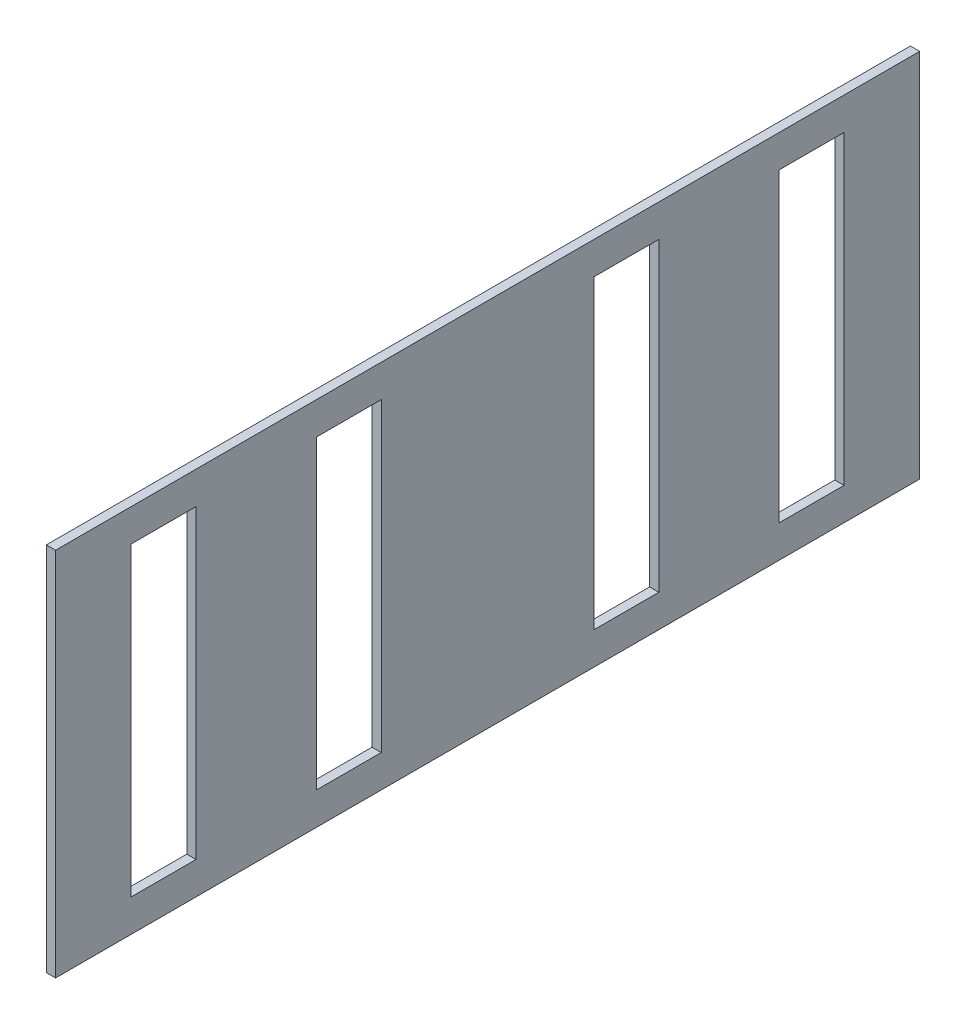
ISO-10303-21;
HEADER;
FILE_DESCRIPTION(('STEP AP214'),'2;1');
FILE_NAME('part.step','',(''),(''),'','','');
FILE_SCHEMA(('AUTOMOTIVE_DESIGN { 1 0 10303 214 1 1 1 1 }'));
ENDSEC;
DATA;
#1=APPLICATION_CONTEXT('core data for automotive mechanical design processes');
#2=APPLICATION_PROTOCOL_DEFINITION('international standard','automotive_design',2000,#1);
#3=PRODUCT_CONTEXT('',#1,'mechanical');
#4=PRODUCT('Part','Part','',(#3));
#5=PRODUCT_RELATED_PRODUCT_CATEGORY('part','',(#4));
#6=PRODUCT_DEFINITION_FORMATION('','',#4);
#7=PRODUCT_DEFINITION_CONTEXT('part definition',#1,'design');
#8=PRODUCT_DEFINITION('design','',#6,#7);
#9=PRODUCT_DEFINITION_SHAPE('','',#8);
#10=(LENGTH_UNIT() NAMED_UNIT(*) SI_UNIT(.MILLI.,.METRE.));
#11=(NAMED_UNIT(*) PLANE_ANGLE_UNIT() SI_UNIT($,.RADIAN.));
#12=(NAMED_UNIT(*) SI_UNIT($,.STERADIAN.) SOLID_ANGLE_UNIT());
#13=UNCERTAINTY_MEASURE_WITH_UNIT(LENGTH_MEASURE(1.E-05),#10,'distance_accuracy_value','');
#14=(GEOMETRIC_REPRESENTATION_CONTEXT(3) GLOBAL_UNCERTAINTY_ASSIGNED_CONTEXT((#13)) GLOBAL_UNIT_ASSIGNED_CONTEXT((#10,
#11,#12)) REPRESENTATION_CONTEXT('',''));
#15=CARTESIAN_POINT('',(0.,0.,0.));
#16=DIRECTION('',(0.,0.,1.));
#17=DIRECTION('',(1.,0.,0.));
#18=AXIS2_PLACEMENT_3D('',#15,#16,#17);
#19=CARTESIAN_POINT('',(2.54,0.,0.));
#20=DIRECTION('',(1.,0.,0.));
#21=DIRECTION('',(0.,0.,-1.));
#22=AXIS2_PLACEMENT_3D('',#19,#20,#21);
#23=PLANE('',#22);
#24=DIRECTION('',(0.,1.,0.));
#25=VECTOR('',#24,1.);
#26=CARTESIAN_POINT('',(2.54,50.8,-118.491));
#27=LINE('',#26,#25);
#28=CARTESIAN_POINT('',(2.54,-50.8,-118.491));
#29=VERTEX_POINT('',#28);
#30=CARTESIAN_POINT('',(2.54,50.8,-118.491));
#31=VERTEX_POINT('',#30);
#32=EDGE_CURVE('E303',#29,#31,#27,.T.);
#33=ORIENTED_EDGE('',*,*,#32,.T.);
#34=DIRECTION('',(0.,0.,1.));
#35=VECTOR('',#34,1.);
#36=CARTESIAN_POINT('',(2.54,50.8,118.491));
#37=LINE('',#36,#35);
#38=CARTESIAN_POINT('',(2.54,50.8,118.491));
#39=VERTEX_POINT('',#38);
#40=EDGE_CURVE('E306',#31,#39,#37,.T.);
#41=ORIENTED_EDGE('',*,*,#40,.T.);
#42=DIRECTION('',(0.,-1.,0.));
#43=VECTOR('',#42,1.);
#44=CARTESIAN_POINT('',(2.54,50.8,118.491));
#45=LINE('',#44,#43);
#46=CARTESIAN_POINT('',(2.54,-50.8,118.491));
#47=VERTEX_POINT('',#46);
#48=EDGE_CURVE('E309',#39,#47,#45,.T.);
#49=ORIENTED_EDGE('',*,*,#48,.T.);
#50=DIRECTION('',(0.,0.,-1.));
#51=VECTOR('',#50,1.);
#52=CARTESIAN_POINT('',(2.54,-50.8,118.491));
#53=LINE('',#52,#51);
#54=EDGE_CURVE('E311',#47,#29,#53,.T.);
#55=ORIENTED_EDGE('',*,*,#54,.T.);
#56=EDGE_LOOP('',(#33,#41,#49,#55));
#57=FACE_BOUND('',#56,.T.);
#58=DIRECTION('',(0.,0.,1.));
#59=VECTOR('',#58,1.);
#60=CARTESIAN_POINT('',(2.54,41.91,-79.9750749999999));
#61=LINE('',#60,#59);
#62=CARTESIAN_POINT('',(2.54,41.91,-97.7550749999999));
#63=VERTEX_POINT('',#62);
#64=CARTESIAN_POINT('',(2.54,41.91,-79.9750749999999));
#65=VERTEX_POINT('',#64);
#66=EDGE_CURVE('E274',#63,#65,#61,.T.);
#67=ORIENTED_EDGE('',*,*,#66,.F.);
#68=DIRECTION('',(0.,1.,0.));
#69=VECTOR('',#68,1.);
#70=CARTESIAN_POINT('',(2.54,41.91,-97.7550749999999));
#71=LINE('',#70,#69);
#72=CARTESIAN_POINT('',(2.54,-41.91,-97.7550749999999));
#73=VERTEX_POINT('',#72);
#74=EDGE_CURVE('E272',#73,#63,#71,.T.);
#75=ORIENTED_EDGE('',*,*,#74,.F.);
#76=DIRECTION('',(0.,0.,-1.));
#77=VECTOR('',#76,1.);
#78=CARTESIAN_POINT('',(2.54,-41.91,-79.9750749999999));
#79=LINE('',#78,#77);
#80=CARTESIAN_POINT('',(2.54,-41.91,-79.9750749999999));
#81=VERTEX_POINT('',#80);
#82=EDGE_CURVE('E280',#81,#73,#79,.T.);
#83=ORIENTED_EDGE('',*,*,#82,.F.);
#84=DIRECTION('',(0.,-1.,0.));
#85=VECTOR('',#84,1.);
#86=CARTESIAN_POINT('',(2.54,41.91,-79.9750749999999));
#87=LINE('',#86,#85);
#88=EDGE_CURVE('E277',#65,#81,#87,.T.);
#89=ORIENTED_EDGE('',*,*,#88,.F.);
#90=EDGE_LOOP('',(#67,#75,#83,#89));
#91=FACE_BOUND('',#90,.T.);
#92=DIRECTION('',(0.,0.,1.));
#93=VECTOR('',#92,1.);
#94=CARTESIAN_POINT('',(2.54,41.91,-29.1750749999999));
#95=LINE('',#94,#93);
#96=CARTESIAN_POINT('',(2.54,41.91,-46.9550749999999));
#97=VERTEX_POINT('',#96);
#98=CARTESIAN_POINT('',(2.54,41.91,-29.1750749999999));
#99=VERTEX_POINT('',#98);
#100=EDGE_CURVE('E243',#97,#99,#95,.T.);
#101=ORIENTED_EDGE('',*,*,#100,.F.);
#102=DIRECTION('',(0.,1.,0.));
#103=VECTOR('',#102,1.);
#104=CARTESIAN_POINT('',(2.54,41.91,-46.9550749999999));
#105=LINE('',#104,#103);
#106=CARTESIAN_POINT('',(2.54,-41.91,-46.9550749999999));
#107=VERTEX_POINT('',#106);
#108=EDGE_CURVE('E241',#107,#97,#105,.T.);
#109=ORIENTED_EDGE('',*,*,#108,.F.);
#110=DIRECTION('',(0.,0.,-1.));
#111=VECTOR('',#110,1.);
#112=CARTESIAN_POINT('',(2.54,-41.91,-29.1750749999999));
#113=LINE('',#112,#111);
#114=CARTESIAN_POINT('',(2.54,-41.91,-29.1750749999999));
#115=VERTEX_POINT('',#114);
#116=EDGE_CURVE('E249',#115,#107,#113,.T.);
#117=ORIENTED_EDGE('',*,*,#116,.F.);
#118=DIRECTION('',(0.,-1.,0.));
#119=VECTOR('',#118,1.);
#120=CARTESIAN_POINT('',(2.54,41.91,-29.1750749999999));
#121=LINE('',#120,#119);
#122=EDGE_CURVE('E246',#99,#115,#121,.T.);
#123=ORIENTED_EDGE('',*,*,#122,.F.);
#124=EDGE_LOOP('',(#101,#109,#117,#123));
#125=FACE_BOUND('',#124,.T.);
#126=DIRECTION('',(0.,0.,1.));
#127=VECTOR('',#126,1.);
#128=CARTESIAN_POINT('',(2.54,41.91,79.9750749999998));
#129=LINE('',#128,#127);
#130=CARTESIAN_POINT('',(2.54,41.91,79.9750749999998));
#131=VERTEX_POINT('',#130);
#132=CARTESIAN_POINT('',(2.54,41.91,97.7550749999998));
#133=VERTEX_POINT('',#132);
#134=EDGE_CURVE('E212',#131,#133,#129,.T.);
#135=ORIENTED_EDGE('',*,*,#134,.F.);
#136=DIRECTION('',(0.,1.,0.));
#137=VECTOR('',#136,1.);
#138=CARTESIAN_POINT('',(2.54,41.91,79.9750749999998));
#139=LINE('',#138,#137);
#140=CARTESIAN_POINT('',(2.54,-41.91,79.9750749999999));
#141=VERTEX_POINT('',#140);
#142=EDGE_CURVE('E210',#141,#131,#139,.T.);
#143=ORIENTED_EDGE('',*,*,#142,.F.);
#144=DIRECTION('',(0.,0.,-1.));
#145=VECTOR('',#144,1.);
#146=CARTESIAN_POINT('',(2.54,-41.91,79.9750749999999));
#147=LINE('',#146,#145);
#148=CARTESIAN_POINT('',(2.54,-41.91,97.7550749999999));
#149=VERTEX_POINT('',#148);
#150=EDGE_CURVE('E218',#149,#141,#147,.T.);
#151=ORIENTED_EDGE('',*,*,#150,.F.);
#152=DIRECTION('',(0.,-1.,0.));
#153=VECTOR('',#152,1.);
#154=CARTESIAN_POINT('',(2.54,41.91,97.7550749999998));
#155=LINE('',#154,#153);
#156=EDGE_CURVE('E215',#133,#149,#155,.T.);
#157=ORIENTED_EDGE('',*,*,#156,.F.);
#158=EDGE_LOOP('',(#135,#143,#151,#157));
#159=FACE_BOUND('',#158,.T.);
#160=DIRECTION('',(0.,-1.,0.));
#161=VECTOR('',#160,1.);
#162=CARTESIAN_POINT('',(2.54,41.91,46.9550749999999));
#163=LINE('',#162,#161);
#164=CARTESIAN_POINT('',(2.54,41.91,46.9550749999999));
#165=VERTEX_POINT('',#164);
#166=CARTESIAN_POINT('',(2.54,-41.9099999999999,46.9550749999999));
#167=VERTEX_POINT('',#166);
#168=EDGE_CURVE('E182',#165,#167,#163,.T.);
#169=ORIENTED_EDGE('',*,*,#168,.F.);
#170=DIRECTION('',(0.,0.,1.));
#171=VECTOR('',#170,1.);
#172=CARTESIAN_POINT('',(2.54,41.91,29.1750749999999));
#173=LINE('',#172,#171);
#174=CARTESIAN_POINT('',(2.54,41.91,29.1750749999999));
#175=VERTEX_POINT('',#174);
#176=EDGE_CURVE('E174',#175,#165,#173,.T.);
#177=ORIENTED_EDGE('',*,*,#176,.F.);
#178=DIRECTION('',(0.,1.,0.));
#179=VECTOR('',#178,1.);
#180=CARTESIAN_POINT('',(2.54,41.91,29.1750749999999));
#181=LINE('',#180,#179);
#182=CARTESIAN_POINT('',(2.54,-41.9099999999999,29.1750749999999));
#183=VERTEX_POINT('',#182);
#184=EDGE_CURVE('E196',#183,#175,#181,.T.);
#185=ORIENTED_EDGE('',*,*,#184,.F.);
#186=DIRECTION('',(0.,0.,-1.));
#187=VECTOR('',#186,1.);
#188=CARTESIAN_POINT('',(2.54,-41.9099999999999,29.1750749999999));
#189=LINE('',#188,#187);
#190=EDGE_CURVE('E194',#167,#183,#189,.T.);
#191=ORIENTED_EDGE('',*,*,#190,.F.);
#192=EDGE_LOOP('',(#169,#177,#185,#191));
#193=FACE_BOUND('',#192,.T.);
#194=ADVANCED_FACE('F37',(#57,#91,#125,#159,#193),#23,.T.);
#195=CARTESIAN_POINT('',(0.,0.,0.));
#196=DIRECTION('',(1.,0.,0.));
#197=DIRECTION('',(0.,0.,-1.));
#198=AXIS2_PLACEMENT_3D('',#195,#196,#197);
#199=PLANE('',#198);
#200=DIRECTION('',(0.,1.,0.));
#201=VECTOR('',#200,1.);
#202=CARTESIAN_POINT('',(0.,41.91,79.9750749999998));
#203=LINE('',#202,#201);
#204=CARTESIAN_POINT('',(0.,-41.91,79.9750749999999));
#205=VERTEX_POINT('',#204);
#206=CARTESIAN_POINT('',(0.,41.91,79.9750749999998));
#207=VERTEX_POINT('',#206);
#208=EDGE_CURVE('E190',#205,#207,#203,.T.);
#209=ORIENTED_EDGE('',*,*,#208,.T.);
#210=DIRECTION('',(0.,0.,1.));
#211=VECTOR('',#210,1.);
#212=CARTESIAN_POINT('',(0.,41.91,79.9750749999998));
#213=LINE('',#212,#211);
#214=CARTESIAN_POINT('',(0.,41.91,97.7550749999998));
#215=VERTEX_POINT('',#214);
#216=EDGE_CURVE('E223',#207,#215,#213,.T.);
#217=ORIENTED_EDGE('',*,*,#216,.T.);
#218=DIRECTION('',(0.,-1.,0.));
#219=VECTOR('',#218,1.);
#220=CARTESIAN_POINT('',(0.,41.91,97.7550749999998));
#221=LINE('',#220,#219);
#222=CARTESIAN_POINT('',(0.,-41.91,97.7550749999999));
#223=VERTEX_POINT('',#222);
#224=EDGE_CURVE('E226',#215,#223,#221,.T.);
#225=ORIENTED_EDGE('',*,*,#224,.T.);
#226=DIRECTION('',(0.,0.,-1.));
#227=VECTOR('',#226,1.);
#228=CARTESIAN_POINT('',(0.,-41.91,79.9750749999999));
#229=LINE('',#228,#227);
#230=EDGE_CURVE('E213',#223,#205,#229,.T.);
#231=ORIENTED_EDGE('',*,*,#230,.T.);
#232=EDGE_LOOP('',(#209,#217,#225,#231));
#233=FACE_BOUND('',#232,.T.);
#234=DIRECTION('',(0.,1.,0.));
#235=VECTOR('',#234,1.);
#236=CARTESIAN_POINT('',(0.,41.91,-97.7550749999999));
#237=LINE('',#236,#235);
#238=CARTESIAN_POINT('',(0.,-41.91,-97.7550749999999));
#239=VERTEX_POINT('',#238);
#240=CARTESIAN_POINT('',(0.,41.91,-97.7550749999999));
#241=VERTEX_POINT('',#240);
#242=EDGE_CURVE('E271',#239,#241,#237,.T.);
#243=ORIENTED_EDGE('',*,*,#242,.T.);
#244=DIRECTION('',(0.,0.,1.));
#245=VECTOR('',#244,1.);
#246=CARTESIAN_POINT('',(0.,41.91,-79.9750749999999));
#247=LINE('',#246,#245);
#248=CARTESIAN_POINT('',(0.,41.91,-79.9750749999999));
#249=VERTEX_POINT('',#248);
#250=EDGE_CURVE('E285',#241,#249,#247,.T.);
#251=ORIENTED_EDGE('',*,*,#250,.T.);
#252=DIRECTION('',(0.,-1.,0.));
#253=VECTOR('',#252,1.);
#254=CARTESIAN_POINT('',(0.,41.91,-79.9750749999999));
#255=LINE('',#254,#253);
#256=CARTESIAN_POINT('',(0.,-41.91,-79.9750749999999));
#257=VERTEX_POINT('',#256);
#258=EDGE_CURVE('E288',#249,#257,#255,.T.);
#259=ORIENTED_EDGE('',*,*,#258,.T.);
#260=DIRECTION('',(0.,0.,-1.));
#261=VECTOR('',#260,1.);
#262=CARTESIAN_POINT('',(0.,-41.91,-79.9750749999999));
#263=LINE('',#262,#261);
#264=EDGE_CURVE('E275',#257,#239,#263,.T.);
#265=ORIENTED_EDGE('',*,*,#264,.T.);
#266=EDGE_LOOP('',(#243,#251,#259,#265));
#267=FACE_BOUND('',#266,.T.);
#268=DIRECTION('',(0.,1.,0.));
#269=VECTOR('',#268,1.);
#270=CARTESIAN_POINT('',(0.,50.8,-118.491));
#271=LINE('',#270,#269);
#272=CARTESIAN_POINT('',(0.,-50.8,-118.491));
#273=VERTEX_POINT('',#272);
#274=CARTESIAN_POINT('',(0.,50.8,-118.491));
#275=VERTEX_POINT('',#274);
#276=EDGE_CURVE('E302',#273,#275,#271,.T.);
#277=ORIENTED_EDGE('',*,*,#276,.F.);
#278=DIRECTION('',(0.,0.,-1.));
#279=VECTOR('',#278,1.);
#280=CARTESIAN_POINT('',(0.,-50.8,118.491));
#281=LINE('',#280,#279);
#282=CARTESIAN_POINT('',(0.,-50.8,118.491));
#283=VERTEX_POINT('',#282);
#284=EDGE_CURVE('E307',#283,#273,#281,.T.);
#285=ORIENTED_EDGE('',*,*,#284,.F.);
#286=DIRECTION('',(0.,-1.,0.));
#287=VECTOR('',#286,1.);
#288=CARTESIAN_POINT('',(0.,50.8,118.491));
#289=LINE('',#288,#287);
#290=CARTESIAN_POINT('',(0.,50.8,118.491));
#291=VERTEX_POINT('',#290);
#292=EDGE_CURVE('E318',#291,#283,#289,.T.);
#293=ORIENTED_EDGE('',*,*,#292,.F.);
#294=DIRECTION('',(0.,0.,1.));
#295=VECTOR('',#294,1.);
#296=CARTESIAN_POINT('',(0.,50.8,118.491));
#297=LINE('',#296,#295);
#298=EDGE_CURVE('E316',#275,#291,#297,.T.);
#299=ORIENTED_EDGE('',*,*,#298,.F.);
#300=EDGE_LOOP('',(#277,#285,#293,#299));
#301=FACE_BOUND('',#300,.T.);
#302=DIRECTION('',(0.,1.,0.));
#303=VECTOR('',#302,1.);
#304=CARTESIAN_POINT('',(0.,41.91,-46.9550749999999));
#305=LINE('',#304,#303);
#306=CARTESIAN_POINT('',(0.,-41.91,-46.9550749999999));
#307=VERTEX_POINT('',#306);
#308=CARTESIAN_POINT('',(0.,41.91,-46.9550749999999));
#309=VERTEX_POINT('',#308);
#310=EDGE_CURVE('E240',#307,#309,#305,.T.);
#311=ORIENTED_EDGE('',*,*,#310,.T.);
#312=DIRECTION('',(0.,0.,1.));
#313=VECTOR('',#312,1.);
#314=CARTESIAN_POINT('',(0.,41.91,-29.1750749999999));
#315=LINE('',#314,#313);
#316=CARTESIAN_POINT('',(0.,41.91,-29.1750749999999));
#317=VERTEX_POINT('',#316);
#318=EDGE_CURVE('E254',#309,#317,#315,.T.);
#319=ORIENTED_EDGE('',*,*,#318,.T.);
#320=DIRECTION('',(0.,-1.,0.));
#321=VECTOR('',#320,1.);
#322=CARTESIAN_POINT('',(0.,41.91,-29.1750749999999));
#323=LINE('',#322,#321);
#324=CARTESIAN_POINT('',(0.,-41.91,-29.1750749999999));
#325=VERTEX_POINT('',#324);
#326=EDGE_CURVE('E257',#317,#325,#323,.T.);
#327=ORIENTED_EDGE('',*,*,#326,.T.);
#328=DIRECTION('',(0.,0.,-1.));
#329=VECTOR('',#328,1.);
#330=CARTESIAN_POINT('',(0.,-41.91,-29.1750749999999));
#331=LINE('',#330,#329);
#332=EDGE_CURVE('E244',#325,#307,#331,.T.);
#333=ORIENTED_EDGE('',*,*,#332,.T.);
#334=EDGE_LOOP('',(#311,#319,#327,#333));
#335=FACE_BOUND('',#334,.T.);
#336=DIRECTION('',(0.,0.,1.));
#337=VECTOR('',#336,1.);
#338=CARTESIAN_POINT('',(0.,41.91,29.1750749999999));
#339=LINE('',#338,#337);
#340=CARTESIAN_POINT('',(0.,41.91,29.1750749999999));
#341=VERTEX_POINT('',#340);
#342=CARTESIAN_POINT('',(0.,41.91,46.9550749999999));
#343=VERTEX_POINT('',#342);
#344=EDGE_CURVE('E60',#341,#343,#339,.T.);
#345=ORIENTED_EDGE('',*,*,#344,.T.);
#346=DIRECTION('',(0.,-1.,0.));
#347=VECTOR('',#346,1.);
#348=CARTESIAN_POINT('',(0.,41.91,46.9550749999999));
#349=LINE('',#348,#347);
#350=CARTESIAN_POINT('',(0.,-41.9099999999999,46.9550749999999));
#351=VERTEX_POINT('',#350);
#352=EDGE_CURVE('E189',#343,#351,#349,.T.);
#353=ORIENTED_EDGE('',*,*,#352,.T.);
#354=DIRECTION('',(0.,0.,-1.));
#355=VECTOR('',#354,1.);
#356=CARTESIAN_POINT('',(0.,-41.9099999999999,29.1750749999999));
#357=LINE('',#356,#355);
#358=CARTESIAN_POINT('',(0.,-41.9099999999999,29.1750749999999));
#359=VERTEX_POINT('',#358);
#360=EDGE_CURVE('E202',#351,#359,#357,.T.);
#361=ORIENTED_EDGE('',*,*,#360,.T.);
#362=DIRECTION('',(0.,1.,0.));
#363=VECTOR('',#362,1.);
#364=CARTESIAN_POINT('',(0.,41.91,29.1750749999999));
#365=LINE('',#364,#363);
#366=EDGE_CURVE('E183',#359,#341,#365,.T.);
#367=ORIENTED_EDGE('',*,*,#366,.T.);
#368=EDGE_LOOP('',(#345,#353,#361,#367));
#369=FACE_BOUND('',#368,.T.);
#370=ADVANCED_FACE('F336',(#233,#267,#301,#335,#369),#199,.F.);
#371=CARTESIAN_POINT('',(2.54,50.8,-118.491));
#372=DIRECTION('',(0.,0.,1.));
#373=DIRECTION('',(1.,0.,0.));
#374=AXIS2_PLACEMENT_3D('',#371,#372,#373);
#375=PLANE('',#374);
#376=ORIENTED_EDGE('',*,*,#276,.T.);
#377=DIRECTION('',(-1.,0.,0.));
#378=VECTOR('',#377,1.);
#379=CARTESIAN_POINT('',(2.54,50.8,-118.491));
#380=LINE('',#379,#378);
#381=EDGE_CURVE('E11',#31,#275,#380,.T.);
#382=ORIENTED_EDGE('',*,*,#381,.F.);
#383=ORIENTED_EDGE('',*,*,#32,.F.);
#384=DIRECTION('',(-1.,0.,0.));
#385=VECTOR('',#384,1.);
#386=CARTESIAN_POINT('',(2.54,-50.8,-118.491));
#387=LINE('',#386,#385);
#388=EDGE_CURVE('E313',#29,#273,#387,.T.);
#389=ORIENTED_EDGE('',*,*,#388,.T.);
#390=EDGE_LOOP('',(#376,#382,#383,#389));
#391=FACE_BOUND('',#390,.T.);
#392=ADVANCED_FACE('F39',(#391),#375,.F.);
#393=CARTESIAN_POINT('',(2.54,50.8,118.491));
#394=DIRECTION('',(0.,-1.,0.));
#395=DIRECTION('',(0.,0.,-1.));
#396=AXIS2_PLACEMENT_3D('',#393,#394,#395);
#397=PLANE('',#396);
#398=ORIENTED_EDGE('',*,*,#298,.T.);
#399=DIRECTION('',(-1.,0.,0.));
#400=VECTOR('',#399,1.);
#401=CARTESIAN_POINT('',(2.54,50.8,118.491));
#402=LINE('',#401,#400);
#403=EDGE_CURVE('E45',#39,#291,#402,.T.);
#404=ORIENTED_EDGE('',*,*,#403,.F.);
#405=ORIENTED_EDGE('',*,*,#40,.F.);
#406=ORIENTED_EDGE('',*,*,#381,.T.);
#407=EDGE_LOOP('',(#398,#404,#405,#406));
#408=FACE_BOUND('',#407,.T.);
#409=ADVANCED_FACE('F347',(#408),#397,.F.);
#410=CARTESIAN_POINT('',(2.54,50.8,118.491));
#411=DIRECTION('',(0.,0.,-1.));
#412=DIRECTION('',(-1.,0.,0.));
#413=AXIS2_PLACEMENT_3D('',#410,#411,#412);
#414=PLANE('',#413);
#415=ORIENTED_EDGE('',*,*,#292,.T.);
#416=DIRECTION('',(-1.,0.,0.));
#417=VECTOR('',#416,1.);
#418=CARTESIAN_POINT('',(2.54,-50.8,118.491));
#419=LINE('',#418,#417);
#420=EDGE_CURVE('E323',#47,#283,#419,.T.);
#421=ORIENTED_EDGE('',*,*,#420,.F.);
#422=ORIENTED_EDGE('',*,*,#48,.F.);
#423=ORIENTED_EDGE('',*,*,#403,.T.);
#424=EDGE_LOOP('',(#415,#421,#422,#423));
#425=FACE_BOUND('',#424,.T.);
#426=ADVANCED_FACE('F330',(#425),#414,.F.);
#427=CARTESIAN_POINT('',(2.54,-50.8,118.491));
#428=DIRECTION('',(0.,1.,0.));
#429=DIRECTION('',(0.,0.,1.));
#430=AXIS2_PLACEMENT_3D('',#427,#428,#429);
#431=PLANE('',#430);
#432=ORIENTED_EDGE('',*,*,#284,.T.);
#433=ORIENTED_EDGE('',*,*,#388,.F.);
#434=ORIENTED_EDGE('',*,*,#54,.F.);
#435=ORIENTED_EDGE('',*,*,#420,.T.);
#436=EDGE_LOOP('',(#432,#433,#434,#435));
#437=FACE_BOUND('',#436,.T.);
#438=ADVANCED_FACE('F340',(#437),#431,.F.);
#439=CARTESIAN_POINT('',(2.54,41.91,-97.7550749999999));
#440=DIRECTION('',(0.,0.,1.));
#441=DIRECTION('',(0.,-1.,0.));
#442=AXIS2_PLACEMENT_3D('',#439,#440,#441);
#443=PLANE('',#442);
#444=ORIENTED_EDGE('',*,*,#242,.F.);
#445=DIRECTION('',(-1.,0.,0.));
#446=VECTOR('',#445,1.);
#447=CARTESIAN_POINT('',(2.54,-41.91,-97.7550749999999));
#448=LINE('',#447,#446);
#449=EDGE_CURVE('E282',#73,#239,#448,.T.);
#450=ORIENTED_EDGE('',*,*,#449,.F.);
#451=ORIENTED_EDGE('',*,*,#74,.T.);
#452=DIRECTION('',(-1.,0.,0.));
#453=VECTOR('',#452,1.);
#454=CARTESIAN_POINT('',(2.54,41.91,-97.7550749999999));
#455=LINE('',#454,#453);
#456=EDGE_CURVE('E299',#63,#241,#455,.T.);
#457=ORIENTED_EDGE('',*,*,#456,.T.);
#458=EDGE_LOOP('',(#444,#450,#451,#457));
#459=FACE_BOUND('',#458,.T.);
#460=ADVANCED_FACE('F362',(#459),#443,.T.);
#461=CARTESIAN_POINT('',(2.54,41.91,-79.9750749999999));
#462=DIRECTION('',(0.,-1.,0.));
#463=DIRECTION('',(0.,0.,-1.));
#464=AXIS2_PLACEMENT_3D('',#461,#462,#463);
#465=PLANE('',#464);
#466=ORIENTED_EDGE('',*,*,#250,.F.);
#467=ORIENTED_EDGE('',*,*,#456,.F.);
#468=ORIENTED_EDGE('',*,*,#66,.T.);
#469=DIRECTION('',(-1.,0.,0.));
#470=VECTOR('',#469,1.);
#471=CARTESIAN_POINT('',(2.54,41.91,-79.9750749999999));
#472=LINE('',#471,#470);
#473=EDGE_CURVE('E297',#65,#249,#472,.T.);
#474=ORIENTED_EDGE('',*,*,#473,.T.);
#475=EDGE_LOOP('',(#466,#467,#468,#474));
#476=FACE_BOUND('',#475,.T.);
#477=ADVANCED_FACE('F369',(#476),#465,.T.);
#478=CARTESIAN_POINT('',(2.54,41.91,-79.9750749999999));
#479=DIRECTION('',(0.,0.,-1.));
#480=DIRECTION('',(0.,1.,0.));
#481=AXIS2_PLACEMENT_3D('',#478,#479,#480);
#482=PLANE('',#481);
#483=ORIENTED_EDGE('',*,*,#258,.F.);
#484=ORIENTED_EDGE('',*,*,#473,.F.);
#485=ORIENTED_EDGE('',*,*,#88,.T.);
#486=DIRECTION('',(-1.,0.,0.));
#487=VECTOR('',#486,1.);
#488=CARTESIAN_POINT('',(2.54,-41.91,-79.9750749999999));
#489=LINE('',#488,#487);
#490=EDGE_CURVE('E295',#81,#257,#489,.T.);
#491=ORIENTED_EDGE('',*,*,#490,.T.);
#492=EDGE_LOOP('',(#483,#484,#485,#491));
#493=FACE_BOUND('',#492,.T.);
#494=ADVANCED_FACE('F374',(#493),#482,.T.);
#495=CARTESIAN_POINT('',(2.54,-41.91,-79.9750749999999));
#496=DIRECTION('',(0.,1.,0.));
#497=DIRECTION('',(0.,0.,1.));
#498=AXIS2_PLACEMENT_3D('',#495,#496,#497);
#499=PLANE('',#498);
#500=ORIENTED_EDGE('',*,*,#264,.F.);
#501=ORIENTED_EDGE('',*,*,#490,.F.);
#502=ORIENTED_EDGE('',*,*,#82,.T.);
#503=ORIENTED_EDGE('',*,*,#449,.T.);
#504=EDGE_LOOP('',(#500,#501,#502,#503));
#505=FACE_BOUND('',#504,.T.);
#506=ADVANCED_FACE('F382',(#505),#499,.T.);
#507=CARTESIAN_POINT('',(2.54,41.91,-46.9550749999999));
#508=DIRECTION('',(0.,0.,1.));
#509=DIRECTION('',(1.,0.,0.));
#510=AXIS2_PLACEMENT_3D('',#507,#508,#509);
#511=PLANE('',#510);
#512=ORIENTED_EDGE('',*,*,#310,.F.);
#513=DIRECTION('',(-1.,0.,0.));
#514=VECTOR('',#513,1.);
#515=CARTESIAN_POINT('',(2.54,-41.91,-46.9550749999999));
#516=LINE('',#515,#514);
#517=EDGE_CURVE('E251',#107,#307,#516,.T.);
#518=ORIENTED_EDGE('',*,*,#517,.F.);
#519=ORIENTED_EDGE('',*,*,#108,.T.);
#520=DIRECTION('',(-1.,0.,0.));
#521=VECTOR('',#520,1.);
#522=CARTESIAN_POINT('',(2.54,41.91,-46.9550749999999));
#523=LINE('',#522,#521);
#524=EDGE_CURVE('E268',#97,#309,#523,.T.);
#525=ORIENTED_EDGE('',*,*,#524,.T.);
#526=EDGE_LOOP('',(#512,#518,#519,#525));
#527=FACE_BOUND('',#526,.T.);
#528=ADVANCED_FACE('F436',(#527),#511,.T.);
#529=CARTESIAN_POINT('',(2.54,41.91,-29.1750749999999));
#530=DIRECTION('',(0.,-1.,0.));
#531=DIRECTION('',(0.,0.,-1.));
#532=AXIS2_PLACEMENT_3D('',#529,#530,#531);
#533=PLANE('',#532);
#534=ORIENTED_EDGE('',*,*,#318,.F.);
#535=ORIENTED_EDGE('',*,*,#524,.F.);
#536=ORIENTED_EDGE('',*,*,#100,.T.);
#537=DIRECTION('',(-1.,0.,0.));
#538=VECTOR('',#537,1.);
#539=CARTESIAN_POINT('',(2.54,41.91,-29.1750749999999));
#540=LINE('',#539,#538);
#541=EDGE_CURVE('E266',#99,#317,#540,.T.);
#542=ORIENTED_EDGE('',*,*,#541,.T.);
#543=EDGE_LOOP('',(#534,#535,#536,#542));
#544=FACE_BOUND('',#543,.T.);
#545=ADVANCED_FACE('F432',(#544),#533,.T.);
#546=CARTESIAN_POINT('',(2.54,41.91,-29.1750749999999));
#547=DIRECTION('',(0.,0.,-1.));
#548=DIRECTION('',(0.,1.,0.));
#549=AXIS2_PLACEMENT_3D('',#546,#547,#548);
#550=PLANE('',#549);
#551=ORIENTED_EDGE('',*,*,#326,.F.);
#552=ORIENTED_EDGE('',*,*,#541,.F.);
#553=ORIENTED_EDGE('',*,*,#122,.T.);
#554=DIRECTION('',(-1.,0.,0.));
#555=VECTOR('',#554,1.);
#556=CARTESIAN_POINT('',(2.54,-41.91,-29.1750749999999));
#557=LINE('',#556,#555);
#558=EDGE_CURVE('E264',#115,#325,#557,.T.);
#559=ORIENTED_EDGE('',*,*,#558,.T.);
#560=EDGE_LOOP('',(#551,#552,#553,#559));
#561=FACE_BOUND('',#560,.T.);
#562=ADVANCED_FACE('F428',(#561),#550,.T.);
#563=CARTESIAN_POINT('',(2.54,-41.91,-29.1750749999999));
#564=DIRECTION('',(0.,1.,0.));
#565=DIRECTION('',(0.,0.,1.));
#566=AXIS2_PLACEMENT_3D('',#563,#564,#565);
#567=PLANE('',#566);
#568=ORIENTED_EDGE('',*,*,#332,.F.);
#569=ORIENTED_EDGE('',*,*,#558,.F.);
#570=ORIENTED_EDGE('',*,*,#116,.T.);
#571=ORIENTED_EDGE('',*,*,#517,.T.);
#572=EDGE_LOOP('',(#568,#569,#570,#571));
#573=FACE_BOUND('',#572,.T.);
#574=ADVANCED_FACE('F425',(#573),#567,.T.);
#575=CARTESIAN_POINT('',(2.54,41.91,79.9750749999998));
#576=DIRECTION('',(0.,0.,1.));
#577=DIRECTION('',(0.,-1.,0.));
#578=AXIS2_PLACEMENT_3D('',#575,#576,#577);
#579=PLANE('',#578);
#580=ORIENTED_EDGE('',*,*,#208,.F.);
#581=DIRECTION('',(-1.,0.,0.));
#582=VECTOR('',#581,1.);
#583=CARTESIAN_POINT('',(2.54,-41.91,79.9750749999999));
#584=LINE('',#583,#582);
#585=EDGE_CURVE('E220',#141,#205,#584,.T.);
#586=ORIENTED_EDGE('',*,*,#585,.F.);
#587=ORIENTED_EDGE('',*,*,#142,.T.);
#588=DIRECTION('',(-1.,0.,0.));
#589=VECTOR('',#588,1.);
#590=CARTESIAN_POINT('',(2.54,41.91,79.9750749999998));
#591=LINE('',#590,#589);
#592=EDGE_CURVE('E237',#131,#207,#591,.T.);
#593=ORIENTED_EDGE('',*,*,#592,.T.);
#594=EDGE_LOOP('',(#580,#586,#587,#593));
#595=FACE_BOUND('',#594,.T.);
#596=ADVANCED_FACE('F407',(#595),#579,.T.);
#597=CARTESIAN_POINT('',(2.54,41.91,79.9750749999998));
#598=DIRECTION('',(0.,-1.,0.));
#599=DIRECTION('',(0.,0.,-1.));
#600=AXIS2_PLACEMENT_3D('',#597,#598,#599);
#601=PLANE('',#600);
#602=ORIENTED_EDGE('',*,*,#216,.F.);
#603=ORIENTED_EDGE('',*,*,#592,.F.);
#604=ORIENTED_EDGE('',*,*,#134,.T.);
#605=DIRECTION('',(-1.,0.,0.));
#606=VECTOR('',#605,1.);
#607=CARTESIAN_POINT('',(2.54,41.91,97.7550749999998));
#608=LINE('',#607,#606);
#609=EDGE_CURVE('E235',#133,#215,#608,.T.);
#610=ORIENTED_EDGE('',*,*,#609,.T.);
#611=EDGE_LOOP('',(#602,#603,#604,#610));
#612=FACE_BOUND('',#611,.T.);
#613=ADVANCED_FACE('F401',(#612),#601,.T.);
#614=CARTESIAN_POINT('',(2.54,41.91,97.7550749999998));
#615=DIRECTION('',(0.,0.,-1.));
#616=DIRECTION('',(0.,1.,0.));
#617=AXIS2_PLACEMENT_3D('',#614,#615,#616);
#618=PLANE('',#617);
#619=ORIENTED_EDGE('',*,*,#224,.F.);
#620=ORIENTED_EDGE('',*,*,#609,.F.);
#621=ORIENTED_EDGE('',*,*,#156,.T.);
#622=DIRECTION('',(-1.,0.,0.));
#623=VECTOR('',#622,1.);
#624=CARTESIAN_POINT('',(2.54,-41.91,97.7550749999999));
#625=LINE('',#624,#623);
#626=EDGE_CURVE('E233',#149,#223,#625,.T.);
#627=ORIENTED_EDGE('',*,*,#626,.T.);
#628=EDGE_LOOP('',(#619,#620,#621,#627));
#629=FACE_BOUND('',#628,.T.);
#630=ADVANCED_FACE('F404',(#629),#618,.T.);
#631=CARTESIAN_POINT('',(2.54,-41.91,79.9750749999999));
#632=DIRECTION('',(0.,1.,0.));
#633=DIRECTION('',(0.,0.,1.));
#634=AXIS2_PLACEMENT_3D('',#631,#632,#633);
#635=PLANE('',#634);
#636=ORIENTED_EDGE('',*,*,#230,.F.);
#637=ORIENTED_EDGE('',*,*,#626,.F.);
#638=ORIENTED_EDGE('',*,*,#150,.T.);
#639=ORIENTED_EDGE('',*,*,#585,.T.);
#640=EDGE_LOOP('',(#636,#637,#638,#639));
#641=FACE_BOUND('',#640,.T.);
#642=ADVANCED_FACE('F410',(#641),#635,.T.);
#643=CARTESIAN_POINT('',(2.54,41.91,29.1750749999999));
#644=DIRECTION('',(0.,-1.,0.));
#645=DIRECTION('',(0.,0.,-1.));
#646=AXIS2_PLACEMENT_3D('',#643,#644,#645);
#647=PLANE('',#646);
#648=ORIENTED_EDGE('',*,*,#344,.F.);
#649=DIRECTION('',(-1.,0.,0.));
#650=VECTOR('',#649,1.);
#651=CARTESIAN_POINT('',(2.54,41.91,29.1750749999999));
#652=LINE('',#651,#650);
#653=EDGE_CURVE('E178',#175,#341,#652,.T.);
#654=ORIENTED_EDGE('',*,*,#653,.F.);
#655=ORIENTED_EDGE('',*,*,#176,.T.);
#656=DIRECTION('',(-1.,0.,0.));
#657=VECTOR('',#656,1.);
#658=CARTESIAN_POINT('',(2.54,41.91,46.9550749999999));
#659=LINE('',#658,#657);
#660=EDGE_CURVE('E177',#165,#343,#659,.T.);
#661=ORIENTED_EDGE('',*,*,#660,.T.);
#662=EDGE_LOOP('',(#648,#654,#655,#661));
#663=FACE_BOUND('',#662,.T.);
#664=ADVANCED_FACE('F176',(#663),#647,.T.);
#665=CARTESIAN_POINT('',(2.54,41.91,46.9550749999999));
#666=DIRECTION('',(0.,0.,-1.));
#667=DIRECTION('',(-1.,0.,0.));
#668=AXIS2_PLACEMENT_3D('',#665,#666,#667);
#669=PLANE('',#668);
#670=ORIENTED_EDGE('',*,*,#352,.F.);
#671=ORIENTED_EDGE('',*,*,#660,.F.);
#672=ORIENTED_EDGE('',*,*,#168,.T.);
#673=DIRECTION('',(-1.,0.,0.));
#674=VECTOR('',#673,1.);
#675=CARTESIAN_POINT('',(2.54,-41.9099999999999,46.9550749999999));
#676=LINE('',#675,#674);
#677=EDGE_CURVE('E191',#167,#351,#676,.T.);
#678=ORIENTED_EDGE('',*,*,#677,.T.);
#679=EDGE_LOOP('',(#670,#671,#672,#678));
#680=FACE_BOUND('',#679,.T.);
#681=ADVANCED_FACE('F186',(#680),#669,.T.);
#682=CARTESIAN_POINT('',(2.54,-41.9099999999999,29.1750749999999));
#683=DIRECTION('',(0.,1.,0.));
#684=DIRECTION('',(0.,0.,1.));
#685=AXIS2_PLACEMENT_3D('',#682,#683,#684);
#686=PLANE('',#685);
#687=ORIENTED_EDGE('',*,*,#360,.F.);
#688=ORIENTED_EDGE('',*,*,#677,.F.);
#689=ORIENTED_EDGE('',*,*,#190,.T.);
#690=DIRECTION('',(-1.,0.,0.));
#691=VECTOR('',#690,1.);
#692=CARTESIAN_POINT('',(2.54,-41.9099999999999,29.1750749999999));
#693=LINE('',#692,#691);
#694=EDGE_CURVE('E52',#183,#359,#693,.T.);
#695=ORIENTED_EDGE('',*,*,#694,.T.);
#696=EDGE_LOOP('',(#687,#688,#689,#695));
#697=FACE_BOUND('',#696,.T.);
#698=ADVANCED_FACE('F499',(#697),#686,.T.);
#699=CARTESIAN_POINT('',(2.54,41.91,29.1750749999999));
#700=DIRECTION('',(0.,0.,1.));
#701=DIRECTION('',(0.,-1.,0.));
#702=AXIS2_PLACEMENT_3D('',#699,#700,#701);
#703=PLANE('',#702);
#704=ORIENTED_EDGE('',*,*,#366,.F.);
#705=ORIENTED_EDGE('',*,*,#694,.F.);
#706=ORIENTED_EDGE('',*,*,#184,.T.);
#707=ORIENTED_EDGE('',*,*,#653,.T.);
#708=EDGE_LOOP('',(#704,#705,#706,#707));
#709=FACE_BOUND('',#708,.T.);
#710=ADVANCED_FACE('F507',(#709),#703,.T.);
#711=CLOSED_SHELL('',(#194,#370,#392,#409,#426,#438,#460,#477,#494,#506,#528,#545,#562,#574,
#596,#613,#630,#642,#664,#681,#698,#710));
#712=MANIFOLD_SOLID_BREP('B2',#711);
#713=ADVANCED_BREP_SHAPE_REPRESENTATION('',(#18,#712),#14);
#714=SHAPE_DEFINITION_REPRESENTATION(#9,#713);
ENDSEC;
END-ISO-10303-21;
